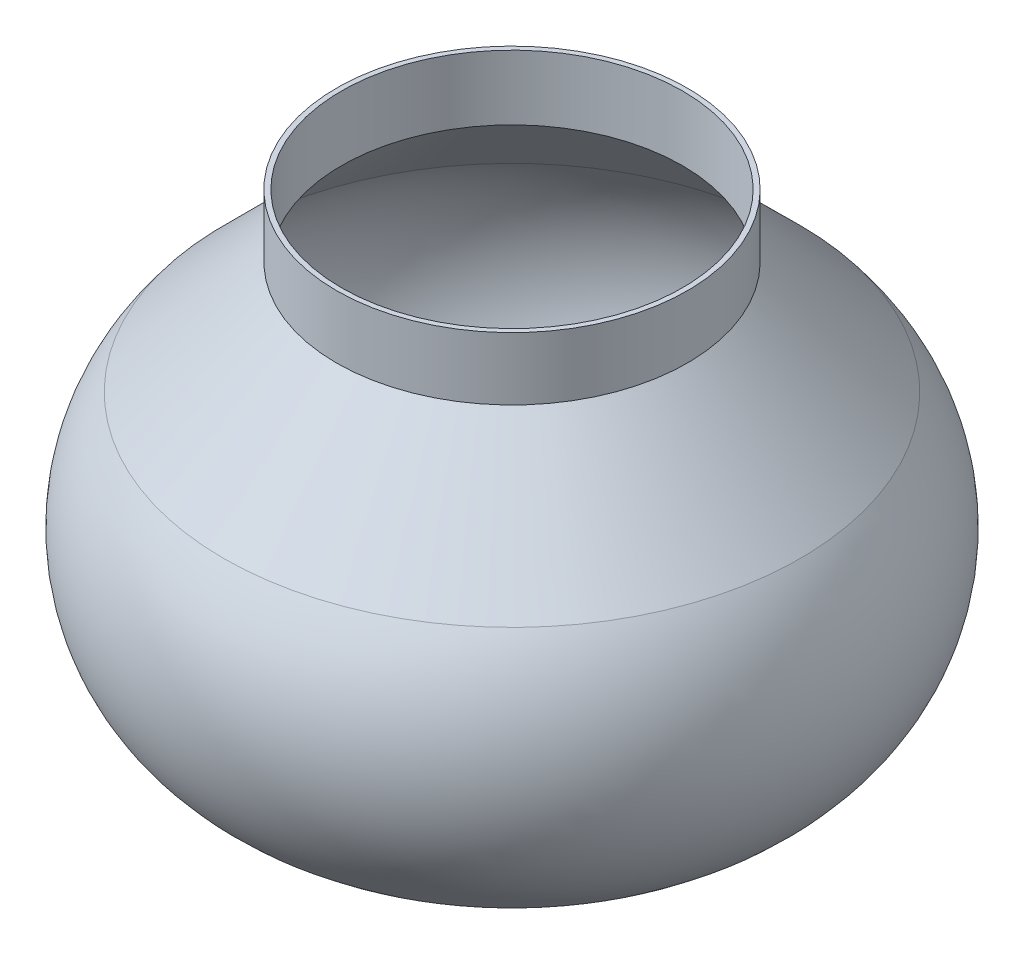
ISO-10303-21;
HEADER;
FILE_DESCRIPTION(('STEP AP214'),'2;1');
FILE_NAME('part.step','',(''),(''),'','','');
FILE_SCHEMA(('AUTOMOTIVE_DESIGN { 1 0 10303 214 1 1 1 1 }'));
ENDSEC;
DATA;
#1=APPLICATION_CONTEXT('core data for automotive mechanical design processes');
#2=APPLICATION_PROTOCOL_DEFINITION('international standard','automotive_design',2000,#1);
#3=PRODUCT_CONTEXT('',#1,'mechanical');
#4=PRODUCT('Part','Part','',(#3));
#5=PRODUCT_RELATED_PRODUCT_CATEGORY('part','',(#4));
#6=PRODUCT_DEFINITION_FORMATION('','',#4);
#7=PRODUCT_DEFINITION_CONTEXT('part definition',#1,'design');
#8=PRODUCT_DEFINITION('design','',#6,#7);
#9=PRODUCT_DEFINITION_SHAPE('','',#8);
#10=(LENGTH_UNIT() NAMED_UNIT(*) SI_UNIT(.MILLI.,.METRE.));
#11=(NAMED_UNIT(*) PLANE_ANGLE_UNIT() SI_UNIT($,.RADIAN.));
#12=(NAMED_UNIT(*) SI_UNIT($,.STERADIAN.) SOLID_ANGLE_UNIT());
#13=UNCERTAINTY_MEASURE_WITH_UNIT(LENGTH_MEASURE(1.E-05),#10,'distance_accuracy_value','');
#14=(GEOMETRIC_REPRESENTATION_CONTEXT(3) GLOBAL_UNCERTAINTY_ASSIGNED_CONTEXT((#13)) GLOBAL_UNIT_ASSIGNED_CONTEXT((#10,
#11,#12)) REPRESENTATION_CONTEXT('',''));
#15=CARTESIAN_POINT('',(0.,0.,0.));
#16=DIRECTION('',(0.,0.,1.));
#17=DIRECTION('',(1.,0.,0.));
#18=AXIS2_PLACEMENT_3D('',#15,#16,#17);
#19=CARTESIAN_POINT('',(0.,0.,0.));
#20=DIRECTION('',(0.,1.,0.));
#21=DIRECTION('',(0.,0.,1.));
#22=AXIS2_PLACEMENT_3D('',#19,#20,#21);
#23=PLANE('',#22);
#24=CARTESIAN_POINT('',(0.,0.,0.));
#25=DIRECTION('',(0.,1.,0.));
#26=DIRECTION('',(0.,0.,1.));
#27=AXIS2_PLACEMENT_3D('',#24,#25,#26);
#28=CIRCLE('',#27,71.12);
#29=CARTESIAN_POINT('',(0.,0.,71.12));
#30=VERTEX_POINT('',#29);
#31=EDGE_CURVE('E10',#30,#30,#28,.T.);
#32=ORIENTED_EDGE('',*,*,#31,.F.);
#33=EDGE_LOOP('',(#32));
#34=FACE_BOUND('',#33,.T.);
#35=ADVANCED_FACE('F31',(#34),#23,.F.);
#36=CARTESIAN_POINT('',(0.,74.4523718621407,0.));
#37=DIRECTION('',(0.,1.,0.));
#38=DIRECTION('',(0.,0.,1.));
#39=AXIS2_PLACEMENT_3D('',#36,#37,#38);
#40=DEGENERATE_TOROIDAL_SURFACE('',#39,58.0136,75.597178498,.T.);
#41=CARTESIAN_POINT('',(0.,121.932768447452,0.));
#42=DIRECTION('',(0.,1.,0.));
#43=DIRECTION('',(0.,0.,1.));
#44=AXIS2_PLACEMENT_3D('',#41,#42,#43);
#45=CIRCLE('',#44,116.84);
#46=CARTESIAN_POINT('',(0.,121.932768447452,116.84));
#47=VERTEX_POINT('',#46);
#48=EDGE_CURVE('E37',#47,#47,#45,.T.);
#49=ORIENTED_EDGE('',*,*,#48,.F.);
#50=EDGE_LOOP('',(#49));
#51=FACE_BOUND('',#50,.T.);
#52=ORIENTED_EDGE('',*,*,#31,.T.);
#53=EDGE_LOOP('',(#52));
#54=FACE_BOUND('',#53,.T.);
#55=ADVANCED_FACE('F97',(#51,#54),#40,.T.);
#56=CARTESIAN_POINT('',(0.,121.932768447452,0.));
#57=DIRECTION('',(0.,-1.,0.));
#58=DIRECTION('',(0.,0.,-1.));
#59=AXIS2_PLACEMENT_3D('',#56,#57,#58);
#60=CONICAL_SURFACE('',#59,116.84,0.785677398401535);
#61=CARTESIAN_POINT('',(0.,167.64,0.));
#62=DIRECTION('',(0.,1.,0.));
#63=DIRECTION('',(0.,0.,1.));
#64=AXIS2_PLACEMENT_3D('',#61,#62,#63);
#65=CIRCLE('',#64,71.1072351990333);
#66=CARTESIAN_POINT('',(0.,167.64,71.1072351990333));
#67=VERTEX_POINT('',#66);
#68=EDGE_CURVE('E41',#67,#67,#65,.T.);
#69=ORIENTED_EDGE('',*,*,#68,.F.);
#70=EDGE_LOOP('',(#69));
#71=FACE_BOUND('',#70,.T.);
#72=ORIENTED_EDGE('',*,*,#48,.T.);
#73=EDGE_LOOP('',(#72));
#74=FACE_BOUND('',#73,.T.);
#75=ADVANCED_FACE('F92',(#71,#74),#60,.T.);
#76=CARTESIAN_POINT('',(0.,167.64,0.));
#77=DIRECTION('',(0.,1.,0.));
#78=DIRECTION('',(0.,0.,1.));
#79=AXIS2_PLACEMENT_3D('',#76,#77,#78);
#80=CYLINDRICAL_SURFACE('',#79,71.1072351990333);
#81=CARTESIAN_POINT('',(0.,193.04,0.));
#82=DIRECTION('',(0.,1.,0.));
#83=DIRECTION('',(0.,0.,1.));
#84=AXIS2_PLACEMENT_3D('',#81,#82,#83);
#85=CIRCLE('',#84,71.1072351990333);
#86=CARTESIAN_POINT('',(0.,193.04,71.1072351990333));
#87=VERTEX_POINT('',#86);
#88=EDGE_CURVE('E45',#87,#87,#85,.T.);
#89=ORIENTED_EDGE('',*,*,#88,.F.);
#90=EDGE_LOOP('',(#89));
#91=FACE_BOUND('',#90,.T.);
#92=ORIENTED_EDGE('',*,*,#68,.T.);
#93=EDGE_LOOP('',(#92));
#94=FACE_BOUND('',#93,.T.);
#95=ADVANCED_FACE('F86',(#91,#94),#80,.T.);
#96=CARTESIAN_POINT('',(69.1072351350332,193.04,0.));
#97=DIRECTION('',(0.,-1.,0.));
#98=DIRECTION('',(0.,0.,-1.));
#99=AXIS2_PLACEMENT_3D('',#96,#97,#98);
#100=PLANE('',#99);
#101=CARTESIAN_POINT('',(0.,193.04,0.));
#102=DIRECTION('',(0.,1.,0.));
#103=DIRECTION('',(0.,0.,1.));
#104=AXIS2_PLACEMENT_3D('',#101,#102,#103);
#105=CIRCLE('',#104,69.1072351350332);
#106=CARTESIAN_POINT('',(0.,193.04,69.1072351350332));
#107=VERTEX_POINT('',#106);
#108=EDGE_CURVE('E50',#107,#107,#105,.T.);
#109=ORIENTED_EDGE('',*,*,#108,.F.);
#110=EDGE_LOOP('',(#109));
#111=FACE_BOUND('',#110,.T.);
#112=ORIENTED_EDGE('',*,*,#88,.T.);
#113=EDGE_LOOP('',(#112));
#114=FACE_BOUND('',#113,.T.);
#115=ADVANCED_FACE('F80',(#111,#114),#100,.F.);
#116=CARTESIAN_POINT('',(0.,167.64,0.));
#117=DIRECTION('',(0.,1.,0.));
#118=DIRECTION('',(0.,0.,1.));
#119=AXIS2_PLACEMENT_3D('',#116,#117,#118);
#120=CYLINDRICAL_SURFACE('',#119,69.1072351350332);
#121=CARTESIAN_POINT('',(0.,166.811245685655,0.));
#122=DIRECTION('',(0.,1.,0.));
#123=DIRECTION('',(0.,0.,1.));
#124=AXIS2_PLACEMENT_3D('',#121,#122,#123);
#125=CIRCLE('',#124,69.1072351350332);
#126=CARTESIAN_POINT('',(0.,166.811245685655,69.1072351350332));
#127=VERTEX_POINT('',#126);
#128=EDGE_CURVE('E53',#127,#127,#125,.T.);
#129=ORIENTED_EDGE('',*,*,#128,.F.);
#130=EDGE_LOOP('',(#129));
#131=FACE_BOUND('',#130,.T.);
#132=ORIENTED_EDGE('',*,*,#108,.T.);
#133=EDGE_LOOP('',(#132));
#134=FACE_BOUND('',#133,.T.);
#135=ADVANCED_FACE('F74',(#131,#134),#120,.F.);
#136=CARTESIAN_POINT('',(0.,166.811245685655,0.));
#137=DIRECTION('',(0.,-1.,0.));
#138=DIRECTION('',(0.,0.,-1.));
#139=AXIS2_PLACEMENT_3D('',#136,#137,#138);
#140=CONICAL_SURFACE('',#139,69.1072351350332,0.785677398401535);
#141=CARTESIAN_POINT('',(0.,120.59409901404,0.));
#142=DIRECTION('',(0.,1.,0.));
#143=DIRECTION('',(0.,0.,1.));
#144=AXIS2_PLACEMENT_3D('',#141,#142,#143);
#145=CIRCLE('',#144,115.350199906915);
#146=CARTESIAN_POINT('',(0.,120.59409901404,115.350199906915));
#147=VERTEX_POINT('',#146);
#148=EDGE_CURVE('E56',#147,#147,#145,.T.);
#149=ORIENTED_EDGE('',*,*,#148,.F.);
#150=EDGE_LOOP('',(#149));
#151=FACE_BOUND('',#150,.T.);
#152=ORIENTED_EDGE('',*,*,#128,.T.);
#153=EDGE_LOOP('',(#152));
#154=FACE_BOUND('',#153,.T.);
#155=ADVANCED_FACE('F68',(#151,#154),#140,.F.);
#156=CARTESIAN_POINT('',(0.,74.4523718621407,0.));
#157=DIRECTION('',(0.,1.,0.));
#158=DIRECTION('',(0.,0.,1.));
#159=AXIS2_PLACEMENT_3D('',#156,#157,#158);
#160=DEGENERATE_TOROIDAL_SURFACE('',#159,58.0136,73.597178434,.T.);
#161=CARTESIAN_POINT('',(0.,2.000000064,0.));
#162=DIRECTION('',(0.,1.,0.));
#163=DIRECTION('',(0.,0.,1.));
#164=AXIS2_PLACEMENT_3D('',#161,#162,#163);
#165=CIRCLE('',#164,70.9441256764769);
#166=CARTESIAN_POINT('',(0.,2.000000064,70.9441256764769));
#167=VERTEX_POINT('',#166);
#168=EDGE_CURVE('E59',#167,#167,#165,.T.);
#169=ORIENTED_EDGE('',*,*,#168,.F.);
#170=EDGE_LOOP('',(#169));
#171=FACE_BOUND('',#170,.T.);
#172=ORIENTED_EDGE('',*,*,#148,.T.);
#173=EDGE_LOOP('',(#172));
#174=FACE_BOUND('',#173,.T.);
#175=ADVANCED_FACE('F65',(#171,#174),#160,.F.);
#176=CARTESIAN_POINT('',(0.,2.00000006400001,0.));
#177=DIRECTION('',(0.,-1.,0.));
#178=DIRECTION('',(0.,0.,-1.));
#179=AXIS2_PLACEMENT_3D('',#176,#177,#178);
#180=PLANE('',#179);
#181=ORIENTED_EDGE('',*,*,#168,.T.);
#182=EDGE_LOOP('',(#181));
#183=FACE_BOUND('',#182,.T.);
#184=ADVANCED_FACE('F63',(#183),#180,.F.);
#185=CLOSED_SHELL('',(#35,#55,#75,#95,#115,#135,#155,#175,#184));
#186=MANIFOLD_SOLID_BREP('B2',#185);
#187=ADVANCED_BREP_SHAPE_REPRESENTATION('',(#18,#186),#14);
#188=SHAPE_DEFINITION_REPRESENTATION(#9,#187);
ENDSEC;
END-ISO-10303-21;
